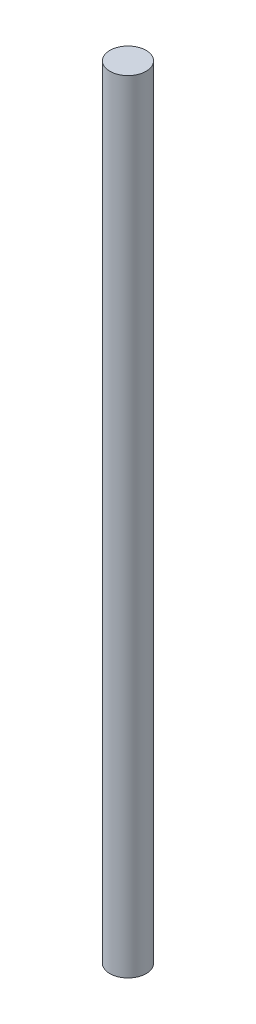
ISO-10303-21;
HEADER;
FILE_DESCRIPTION(('STEP AP214'),'2;1');
FILE_NAME('part.step','',(''),(''),'','','');
FILE_SCHEMA(('AUTOMOTIVE_DESIGN { 1 0 10303 214 1 1 1 1 }'));
ENDSEC;
DATA;
#1=APPLICATION_CONTEXT('core data for automotive mechanical design processes');
#2=APPLICATION_PROTOCOL_DEFINITION('international standard','automotive_design',2000,#1);
#3=PRODUCT_CONTEXT('',#1,'mechanical');
#4=PRODUCT('Part','Part','',(#3));
#5=PRODUCT_RELATED_PRODUCT_CATEGORY('part','',(#4));
#6=PRODUCT_DEFINITION_FORMATION('','',#4);
#7=PRODUCT_DEFINITION_CONTEXT('part definition',#1,'design');
#8=PRODUCT_DEFINITION('design','',#6,#7);
#9=PRODUCT_DEFINITION_SHAPE('','',#8);
#10=(LENGTH_UNIT() NAMED_UNIT(*) SI_UNIT(.MILLI.,.METRE.));
#11=(NAMED_UNIT(*) PLANE_ANGLE_UNIT() SI_UNIT($,.RADIAN.));
#12=(NAMED_UNIT(*) SI_UNIT($,.STERADIAN.) SOLID_ANGLE_UNIT());
#13=UNCERTAINTY_MEASURE_WITH_UNIT(LENGTH_MEASURE(1.E-05),#10,'distance_accuracy_value','');
#14=(GEOMETRIC_REPRESENTATION_CONTEXT(3) GLOBAL_UNCERTAINTY_ASSIGNED_CONTEXT((#13)) GLOBAL_UNIT_ASSIGNED_CONTEXT((#10,
#11,#12)) REPRESENTATION_CONTEXT('',''));
#15=CARTESIAN_POINT('',(0.,0.,0.));
#16=DIRECTION('',(0.,0.,1.));
#17=DIRECTION('',(1.,0.,0.));
#18=AXIS2_PLACEMENT_3D('',#15,#16,#17);
#19=CARTESIAN_POINT('',(0.,83.,0.));
#20=DIRECTION('',(0.,-1.,0.));
#21=DIRECTION('',(0.,0.,-1.));
#22=AXIS2_PLACEMENT_3D('',#19,#20,#21);
#23=CYLINDRICAL_SURFACE('',#22,1.925);
#24=CARTESIAN_POINT('',(0.,83.,0.));
#25=DIRECTION('',(0.,1.,0.));
#26=DIRECTION('',(0.,0.,1.));
#27=AXIS2_PLACEMENT_3D('',#24,#25,#26);
#28=CIRCLE('',#27,1.925);
#29=CARTESIAN_POINT('',(0.,83.,1.925));
#30=VERTEX_POINT('',#29);
#31=EDGE_CURVE('E10',#30,#30,#28,.T.);
#32=ORIENTED_EDGE('',*,*,#31,.F.);
#33=EDGE_LOOP('',(#32));
#34=FACE_BOUND('',#33,.T.);
#35=CARTESIAN_POINT('',(0.,0.,0.));
#36=DIRECTION('',(0.,1.,0.));
#37=DIRECTION('',(0.,0.,1.));
#38=AXIS2_PLACEMENT_3D('',#35,#36,#37);
#39=CIRCLE('',#38,1.925);
#40=CARTESIAN_POINT('',(0.,0.,1.925));
#41=VERTEX_POINT('',#40);
#42=EDGE_CURVE('E40',#41,#41,#39,.T.);
#43=ORIENTED_EDGE('',*,*,#42,.T.);
#44=EDGE_LOOP('',(#43));
#45=FACE_BOUND('',#44,.T.);
#46=ADVANCED_FACE('F37',(#34,#45),#23,.T.);
#47=CARTESIAN_POINT('',(0.,83.,0.));
#48=DIRECTION('',(0.,1.,0.));
#49=DIRECTION('',(0.,0.,1.));
#50=AXIS2_PLACEMENT_3D('',#47,#48,#49);
#51=PLANE('',#50);
#52=ORIENTED_EDGE('',*,*,#31,.T.);
#53=EDGE_LOOP('',(#52));
#54=FACE_BOUND('',#53,.T.);
#55=ADVANCED_FACE('F54',(#54),#51,.T.);
#56=CARTESIAN_POINT('',(0.,0.,0.));
#57=DIRECTION('',(0.,1.,0.));
#58=DIRECTION('',(0.,0.,1.));
#59=AXIS2_PLACEMENT_3D('',#56,#57,#58);
#60=PLANE('',#59);
#61=ORIENTED_EDGE('',*,*,#42,.F.);
#62=EDGE_LOOP('',(#61));
#63=FACE_BOUND('',#62,.T.);
#64=ADVANCED_FACE('F52',(#63),#60,.F.);
#65=CLOSED_SHELL('',(#46,#55,#64));
#66=MANIFOLD_SOLID_BREP('B2',#65);
#67=ADVANCED_BREP_SHAPE_REPRESENTATION('',(#18,#66),#14);
#68=SHAPE_DEFINITION_REPRESENTATION(#9,#67);
ENDSEC;
END-ISO-10303-21;
